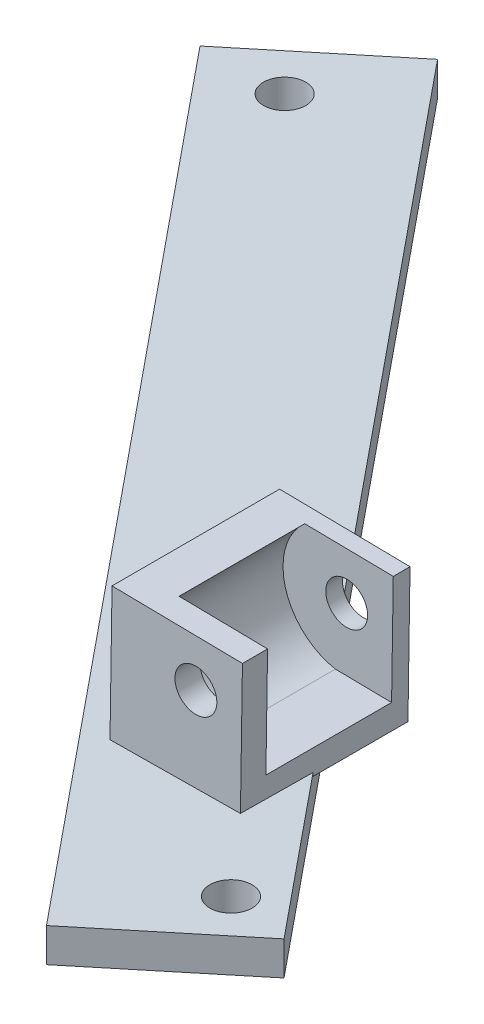
ISO-10303-21;
HEADER;
FILE_DESCRIPTION(('STEP AP214'),'2;1');
FILE_NAME('part.step','',(''),(''),'','','');
FILE_SCHEMA(('AUTOMOTIVE_DESIGN { 1 0 10303 214 1 1 1 1 }'));
ENDSEC;
DATA;
#1=APPLICATION_CONTEXT('core data for automotive mechanical design processes');
#2=APPLICATION_PROTOCOL_DEFINITION('international standard','automotive_design',2000,#1);
#3=PRODUCT_CONTEXT('',#1,'mechanical');
#4=PRODUCT('Part','Part','',(#3));
#5=PRODUCT_RELATED_PRODUCT_CATEGORY('part','',(#4));
#6=PRODUCT_DEFINITION_FORMATION('','',#4);
#7=PRODUCT_DEFINITION_CONTEXT('part definition',#1,'design');
#8=PRODUCT_DEFINITION('design','',#6,#7);
#9=PRODUCT_DEFINITION_SHAPE('','',#8);
#10=(LENGTH_UNIT() NAMED_UNIT(*) SI_UNIT(.MILLI.,.METRE.));
#11=(NAMED_UNIT(*) PLANE_ANGLE_UNIT() SI_UNIT($,.RADIAN.));
#12=(NAMED_UNIT(*) SI_UNIT($,.STERADIAN.) SOLID_ANGLE_UNIT());
#13=UNCERTAINTY_MEASURE_WITH_UNIT(LENGTH_MEASURE(1.E-05),#10,'distance_accuracy_value','');
#14=(GEOMETRIC_REPRESENTATION_CONTEXT(3) GLOBAL_UNCERTAINTY_ASSIGNED_CONTEXT((#13)) GLOBAL_UNIT_ASSIGNED_CONTEXT((#10,
#11,#12)) REPRESENTATION_CONTEXT('',''));
#15=CARTESIAN_POINT('',(0.,0.,0.));
#16=DIRECTION('',(0.,0.,1.));
#17=DIRECTION('',(1.,0.,0.));
#18=AXIS2_PLACEMENT_3D('',#15,#16,#17);
#19=CARTESIAN_POINT('',(1.23244160219368,80.7225949257512,-21.59));
#20=DIRECTION('',(0.0152658371215677,0.999883470318906,0.));
#21=DIRECTION('',(-0.999883470318906,0.0152658371215677,0.));
#22=AXIS2_PLACEMENT_3D('',#19,#20,#21);
#23=PLANE('',#22);
#24=DIRECTION('',(0.,0.,1.));
#25=VECTOR('',#24,1.);
#26=CARTESIAN_POINT('',(-621.150306901994,90.224895891791,-21.59));
#27=LINE('',#26,#25);
#28=CARTESIAN_POINT('',(-621.150306901994,90.224895891791,-21.59));
#29=VERTEX_POINT('',#28);
#30=CARTESIAN_POINT('',(-621.150306901994,90.224895891791,-7.21198114716159));
#31=VERTEX_POINT('',#30);
#32=EDGE_CURVE('E287',#29,#31,#27,.T.);
#33=ORIENTED_EDGE('',*,*,#32,.T.);
#34=DIRECTION('',(-0.634311385000374,0.00968442281047344,-0.773016997752142));
#35=VECTOR('',#34,1.);
#36=CARTESIAN_POINT('',(-377.72567926426,86.5083820907271,289.442594641894));
#37=LINE('',#36,#35);
#38=CARTESIAN_POINT('',(-632.948418817548,90.4050249370161,-21.59));
#39=VERTEX_POINT('',#38);
#40=EDGE_CURVE('E222',#31,#39,#37,.T.);
#41=ORIENTED_EDGE('',*,*,#40,.T.);
#42=DIRECTION('',(-0.999883470318906,0.0152658371215677,0.));
#43=VECTOR('',#42,1.);
#44=CARTESIAN_POINT('',(1.23244160219368,80.7225949257512,-21.59));
#45=LINE('',#44,#43);
#46=EDGE_CURVE('E274',#29,#39,#45,.T.);
#47=ORIENTED_EDGE('',*,*,#46,.F.);
#48=EDGE_LOOP('',(#33,#41,#47));
#49=FACE_BOUND('',#48,.T.);
#50=ADVANCED_FACE('F56',(#49),#23,.F.);
#51=CARTESIAN_POINT('',(-627.893070479448,103.664395922966,-21.59));
#52=DIRECTION('',(0.,0.,1.));
#53=DIRECTION('',(1.,0.,0.));
#54=AXIS2_PLACEMENT_3D('',#51,#52,#53);
#55=CYLINDRICAL_SURFACE('',#54,9.65200000000006);
#56=CARTESIAN_POINT('',(-627.893070479448,103.664395922966,-19.0499999999996));
#57=DIRECTION('',(0.,0.,-1.));
#58=DIRECTION('',(-1.,0.,0.));
#59=AXIS2_PLACEMENT_3D('',#56,#57,#58);
#60=CIRCLE('',#59,9.65200000000008);
#61=CARTESIAN_POINT('',(-629.598897848948,94.164329766067,-19.0499999999997));
#62=VERTEX_POINT('',#61);
#63=CARTESIAN_POINT('',(-634.25254540357,110.925124721748,-19.0499999999998));
#64=VERTEX_POINT('',#63);
#65=EDGE_CURVE('E254',#62,#64,#60,.T.);
#66=ORIENTED_EDGE('',*,*,#65,.T.);
#67=DIRECTION('',(0.,0.,1.));
#68=VECTOR('',#67,1.);
#69=CARTESIAN_POINT('',(-634.25254540357,110.925124721748,-21.59));
#70=LINE('',#69,#68);
#71=CARTESIAN_POINT('',(-634.25254540357,110.925124721748,0.));
#72=VERTEX_POINT('',#71);
#73=EDGE_CURVE('E279',#64,#72,#70,.T.);
#74=ORIENTED_EDGE('',*,*,#73,.T.);
#75=CARTESIAN_POINT('',(-627.893070479448,103.664395922966,0.));
#76=DIRECTION('',(0.,0.,1.));
#77=DIRECTION('',(1.,0.,0.));
#78=AXIS2_PLACEMENT_3D('',#75,#76,#77);
#79=CIRCLE('',#78,9.65200000000006);
#80=CARTESIAN_POINT('',(-629.598897848948,94.164329766067,0.));
#81=VERTEX_POINT('',#80);
#82=EDGE_CURVE('E267',#72,#81,#79,.T.);
#83=ORIENTED_EDGE('',*,*,#82,.T.);
#84=DIRECTION('',(0.,0.,1.));
#85=VECTOR('',#84,1.);
#86=CARTESIAN_POINT('',(-629.598897848948,94.164329766067,-21.59));
#87=LINE('',#86,#85);
#88=EDGE_CURVE('E283',#62,#81,#87,.T.);
#89=ORIENTED_EDGE('',*,*,#88,.F.);
#90=EDGE_LOOP('',(#66,#74,#83,#89));
#91=FACE_BOUND('',#90,.T.);
#92=ADVANCED_FACE('F58',(#91),#55,.F.);
#93=CARTESIAN_POINT('',(1.29060444162685,84.5321509476663,-21.59));
#94=DIRECTION('',(0.0152658371215677,0.999883470318906,0.));
#95=DIRECTION('',(-0.999883470318906,0.0152658371215677,0.));
#96=AXIS2_PLACEMENT_3D('',#93,#94,#95);
#97=PLANE('',#96);
#98=DIRECTION('',(0.,0.,1.));
#99=VECTOR('',#98,1.);
#100=CARTESIAN_POINT('',(-621.092144062561,94.0344519137061,-21.59));
#101=LINE('',#100,#99);
#102=CARTESIAN_POINT('',(-621.092144062561,94.0344519137061,-19.0499999999996));
#103=VERTEX_POINT('',#102);
#104=CARTESIAN_POINT('',(-621.092144062561,94.0344519137061,0.));
#105=VERTEX_POINT('',#104);
#106=EDGE_CURVE('E285',#103,#105,#101,.T.);
#107=ORIENTED_EDGE('',*,*,#106,.F.);
#108=DIRECTION('',(-0.999883470318906,0.0152658371215695,0.));
#109=VECTOR('',#108,1.);
#110=CARTESIAN_POINT('',(1.29060444162699,84.5321509476652,-19.05));
#111=LINE('',#110,#109);
#112=EDGE_CURVE('E79',#103,#62,#111,.T.);
#113=ORIENTED_EDGE('',*,*,#112,.T.);
#114=ORIENTED_EDGE('',*,*,#88,.T.);
#115=DIRECTION('',(-0.999883470318906,0.0152658371215677,0.));
#116=VECTOR('',#115,1.);
#117=CARTESIAN_POINT('',(1.29060444162685,84.5321509476663,0.));
#118=LINE('',#117,#116);
#119=EDGE_CURVE('E271',#105,#81,#118,.T.);
#120=ORIENTED_EDGE('',*,*,#119,.F.);
#121=EDGE_LOOP('',(#107,#113,#114,#120));
#122=FACE_BOUND('',#121,.T.);
#123=ADVANCED_FACE('F340',(#122),#97,.T.);
#124=CARTESIAN_POINT('',(-622.382748504188,9.50230096603983,-21.59));
#125=DIRECTION('',(-0.999883470318906,0.0152658371215677,0.));
#126=DIRECTION('',(-0.0152658371215678,-0.999883470318906,0.));
#127=AXIS2_PLACEMENT_3D('',#124,#125,#126);
#128=PLANE('',#127);
#129=DIRECTION('',(-0.000170947301251259,-0.0111967250440051,-0.999937300097016));
#130=VECTOR('',#129,1.);
#131=CARTESIAN_POINT('',(-621.144892584329,90.5795234627043,-22.4980679115256));
#132=LINE('',#131,#130);
#133=CARTESIAN_POINT('',(-621.140395009121,90.8741061358537,3.81));
#134=VERTEX_POINT('',#133);
#135=CARTESIAN_POINT('',(-621.142277501478,90.750806445438,-7.20143048993949));
#136=VERTEX_POINT('',#135);
#137=EDGE_CURVE('E71',#134,#136,#132,.T.);
#138=ORIENTED_EDGE('',*,*,#137,.T.);
#139=DIRECTION('',(-0.0152627667310032,-0.999682365541718,-0.0200553229001458));
#140=VECTOR('',#139,1.);
#141=CARTESIAN_POINT('',(-622.38665390396,9.24650466437761,-8.83654494860487));
#142=LINE('',#141,#140);
#143=EDGE_CURVE('E225',#136,#31,#142,.T.);
#144=ORIENTED_EDGE('',*,*,#143,.T.);
#145=ORIENTED_EDGE('',*,*,#32,.F.);
#146=DIRECTION('',(-0.0152658371215678,-0.999883470318906,0.));
#147=VECTOR('',#146,1.);
#148=CARTESIAN_POINT('',(-622.382748504188,9.50230096603983,-21.59));
#149=LINE('',#148,#147);
#150=CARTESIAN_POINT('',(-620.837390825843,110.720307289694,-21.59));
#151=VERTEX_POINT('',#150);
#152=EDGE_CURVE('E277',#151,#29,#149,.T.);
#153=ORIENTED_EDGE('',*,*,#152,.F.);
#154=DIRECTION('',(0.,0.,1.));
#155=VECTOR('',#154,1.);
#156=CARTESIAN_POINT('',(-620.837390825843,110.720307289694,-45.3479752360297));
#157=LINE('',#156,#155);
#158=CARTESIAN_POINT('',(-620.837390825843,110.720307289694,-19.0499999999998));
#159=VERTEX_POINT('',#158);
#160=EDGE_CURVE('E262',#151,#159,#157,.T.);
#161=ORIENTED_EDGE('',*,*,#160,.T.);
#162=DIRECTION('',(0.0152658371215684,0.999883470318906,0.));
#163=VECTOR('',#162,1.);
#164=CARTESIAN_POINT('',(-622.382748504188,9.50230096604021,-19.0499999999996));
#165=LINE('',#164,#163);
#166=EDGE_CURVE('E250',#103,#159,#165,.T.);
#167=ORIENTED_EDGE('',*,*,#166,.F.);
#168=ORIENTED_EDGE('',*,*,#106,.T.);
#169=DIRECTION('',(-0.0152658371215623,-0.999883470318906,0.));
#170=VECTOR('',#169,1.);
#171=CARTESIAN_POINT('',(-620.837390825843,110.720307289694,0.));
#172=LINE('',#171,#170);
#173=CARTESIAN_POINT('',(-620.837390825843,110.720307289694,0.));
#174=VERTEX_POINT('',#173);
#175=EDGE_CURVE('E238',#174,#105,#172,.T.);
#176=ORIENTED_EDGE('',*,*,#175,.F.);
#177=DIRECTION('',(0.,0.,-1.));
#178=VECTOR('',#177,1.);
#179=CARTESIAN_POINT('',(-620.837390825843,110.720307289694,3.81));
#180=LINE('',#179,#178);
#181=CARTESIAN_POINT('',(-620.837390825843,110.720307289694,3.81));
#182=VERTEX_POINT('',#181);
#183=EDGE_CURVE('E244',#182,#174,#180,.T.);
#184=ORIENTED_EDGE('',*,*,#183,.F.);
#185=DIRECTION('',(-0.0152658371215623,-0.999883470318906,0.));
#186=VECTOR('',#185,1.);
#187=CARTESIAN_POINT('',(-620.837390825843,110.720307289694,3.81));
#188=LINE('',#187,#186);
#189=EDGE_CURVE('E241',#182,#134,#188,.T.);
#190=ORIENTED_EDGE('',*,*,#189,.T.);
#191=EDGE_LOOP('',(#138,#144,#145,#153,#161,#167,#168,#176,#184,#190));
#192=FACE_BOUND('',#191,.T.);
#193=ADVANCED_FACE('F303',(#192),#128,.F.);
#194=CARTESIAN_POINT('',(-635.371075882775,90.4420131353982,-21.59));
#195=VERTEX_POINT('',#194);
#196=CARTESIAN_POINT('',(-640.914721516246,90.5266513895672,-21.59));
#197=VERTEX_POINT('',#196);
#198=EDGE_CURVE('E273',#195,#197,#45,.T.);
#199=ORIENTED_EDGE('',*,*,#198,.F.);
#200=DIRECTION('',(-0.400047773889427,0.00610777589421889,0.916473935079302));
#201=VECTOR('',#200,1.);
#202=CARTESIAN_POINT('',(-533.46643276404,88.8861721499623,-255.044490632144));
#203=LINE('',#202,#201);
#204=CARTESIAN_POINT('',(-640.914721516246,90.5266513895672,-8.89000000001139));
#205=VERTEX_POINT('',#204);
#206=EDGE_CURVE('E215',#195,#205,#203,.T.);
#207=ORIENTED_EDGE('',*,*,#206,.T.);
#208=DIRECTION('',(0.,0.,1.));
#209=VECTOR('',#208,1.);
#210=CARTESIAN_POINT('',(-640.914721516246,90.5266513895672,-21.59));
#211=LINE('',#210,#209);
#212=EDGE_CURVE('E290',#197,#205,#211,.T.);
#213=ORIENTED_EDGE('',*,*,#212,.F.);
#214=EDGE_LOOP('',(#199,#207,#213));
#215=FACE_BOUND('',#214,.T.);
#216=ADVANCED_FACE('F318',(#215),#23,.F.);
#217=CARTESIAN_POINT('',(-642.147163118439,9.80405646381606,-21.59));
#218=DIRECTION('',(0.999883470318906,-0.0152658371215678,0.));
#219=DIRECTION('',(0.0152658371215678,0.999883470318906,0.));
#220=AXIS2_PLACEMENT_3D('',#217,#218,#219);
#221=PLANE('',#220);
#222=ORIENTED_EDGE('',*,*,#212,.T.);
#223=DIRECTION('',(0.000170947301251259,0.0111967250440051,0.999937300097016));
#224=VECTOR('',#223,1.);
#225=CARTESIAN_POINT('',(-640.917046953941,90.3743396169369,-22.4923901719979));
#226=LINE('',#225,#224);
#227=CARTESIAN_POINT('',(-640.912550349388,90.6688587140116,3.81));
#228=VERTEX_POINT('',#227);
#229=EDGE_CURVE('E209',#205,#228,#226,.T.);
#230=ORIENTED_EDGE('',*,*,#229,.T.);
#231=DIRECTION('',(0.0152658371215677,0.999883470318906,0.));
#232=VECTOR('',#231,1.);
#233=CARTESIAN_POINT('',(-640.914721516246,90.5266513895672,3.81));
#234=LINE('',#233,#232);
#235=CARTESIAN_POINT('',(-640.601805440095,111.02206278747,3.81));
#236=VERTEX_POINT('',#235);
#237=EDGE_CURVE('E235',#228,#236,#234,.T.);
#238=ORIENTED_EDGE('',*,*,#237,.T.);
#239=DIRECTION('',(0.,0.,1.));
#240=VECTOR('',#239,1.);
#241=CARTESIAN_POINT('',(-640.601805440095,111.02206278747,-21.59));
#242=LINE('',#241,#240);
#243=CARTESIAN_POINT('',(-640.601805440095,111.02206278747,-21.59));
#244=VERTEX_POINT('',#243);
#245=EDGE_CURVE('E293',#244,#236,#242,.T.);
#246=ORIENTED_EDGE('',*,*,#245,.F.);
#247=DIRECTION('',(0.0152658371215678,0.999883470318906,0.));
#248=VECTOR('',#247,1.);
#249=CARTESIAN_POINT('',(-642.147163118439,9.80405646381606,-21.59));
#250=LINE('',#249,#248);
#251=EDGE_CURVE('E270',#197,#244,#250,.T.);
#252=ORIENTED_EDGE('',*,*,#251,.F.);
#253=EDGE_LOOP('',(#222,#230,#238,#246,#252));
#254=FACE_BOUND('',#253,.T.);
#255=ADVANCED_FACE('F313',(#254),#221,.F.);
#256=CARTESIAN_POINT('',(1.54535767834408,101.218006323655,-21.59));
#257=DIRECTION('',(-0.015265837121567,-0.999883470318906,0.));
#258=DIRECTION('',(0.999883470318906,-0.015265837121567,0.));
#259=AXIS2_PLACEMENT_3D('',#256,#257,#258);
#260=PLANE('',#259);
#261=ORIENTED_EDGE('',*,*,#245,.T.);
#262=DIRECTION('',(0.999883470318906,-0.0152658371215671,0.));
#263=VECTOR('',#262,1.);
#264=CARTESIAN_POINT('',(-640.601805440095,111.02206278747,3.81));
#265=LINE('',#264,#263);
#266=EDGE_CURVE('E237',#236,#182,#265,.T.);
#267=ORIENTED_EDGE('',*,*,#266,.T.);
#268=ORIENTED_EDGE('',*,*,#183,.T.);
#269=DIRECTION('',(0.999883470318906,-0.0152658371215671,0.));
#270=VECTOR('',#269,1.);
#271=CARTESIAN_POINT('',(-640.601805440095,111.02206278747,0.));
#272=LINE('',#271,#270);
#273=EDGE_CURVE('E232',#72,#174,#272,.T.);
#274=ORIENTED_EDGE('',*,*,#273,.F.);
#275=ORIENTED_EDGE('',*,*,#73,.F.);
#276=DIRECTION('',(0.999883470318906,-0.0152658371215682,0.));
#277=VECTOR('',#276,1.);
#278=CARTESIAN_POINT('',(1.54535767834418,101.218006323654,-19.0499999999998));
#279=LINE('',#278,#277);
#280=EDGE_CURVE('E256',#64,#159,#279,.T.);
#281=ORIENTED_EDGE('',*,*,#280,.T.);
#282=ORIENTED_EDGE('',*,*,#160,.F.);
#283=DIRECTION('',(0.999883470318906,-0.015265837121567,0.));
#284=VECTOR('',#283,1.);
#285=CARTESIAN_POINT('',(1.54535767834408,101.218006323655,-21.59));
#286=LINE('',#285,#284);
#287=EDGE_CURVE('E268',#244,#151,#286,.T.);
#288=ORIENTED_EDGE('',*,*,#287,.F.);
#289=EDGE_LOOP('',(#261,#267,#268,#274,#275,#281,#282,#288));
#290=FACE_BOUND('',#289,.T.);
#291=ADVANCED_FACE('F307',(#290),#260,.F.);
#292=CARTESIAN_POINT('',(0.,0.,-21.59));
#293=DIRECTION('',(0.,0.,1.));
#294=DIRECTION('',(1.,0.,0.));
#295=AXIS2_PLACEMENT_3D('',#292,#293,#294);
#296=PLANE('',#295);
#297=ORIENTED_EDGE('',*,*,#46,.T.);
#298=DIRECTION('',(-0.00119402567209791,0.999999287151093,0.));
#299=VECTOR('',#298,1.);
#300=CARTESIAN_POINT('',(-632.83957058098,-0.755627232241151,-21.59));
#301=LINE('',#300,#299);
#302=CARTESIAN_POINT('',(-632.94849300974,90.467161070984,-21.59));
#303=VERTEX_POINT('',#302);
#304=EDGE_CURVE('E12',#39,#303,#301,.T.);
#305=ORIENTED_EDGE('',*,*,#304,.T.);
#306=DIRECTION('',(-0.999946125618088,-0.0103800703935441,0.));
#307=VECTOR('',#306,1.);
#308=CARTESIAN_POINT('',(-1.00720248977155,97.0271095643389,-21.59));
#309=LINE('',#308,#307);
#310=EDGE_CURVE('E219',#303,#195,#309,.T.);
#311=ORIENTED_EDGE('',*,*,#310,.T.);
#312=ORIENTED_EDGE('',*,*,#198,.T.);
#313=ORIENTED_EDGE('',*,*,#251,.T.);
#314=ORIENTED_EDGE('',*,*,#287,.T.);
#315=ORIENTED_EDGE('',*,*,#152,.T.);
#316=EDGE_LOOP('',(#297,#305,#311,#312,#313,#314,#315));
#317=FACE_BOUND('',#316,.T.);
#318=CARTESIAN_POINT('',(-627.893070479448,103.664395922966,-21.59));
#319=DIRECTION('',(0.,0.,1.));
#320=DIRECTION('',(1.,0.,0.));
#321=AXIS2_PLACEMENT_3D('',#318,#319,#320);
#322=CIRCLE('',#321,3.17500000000009);
#323=CARTESIAN_POINT('',(-624.718070479448,103.664395922966,-21.59));
#324=VERTEX_POINT('',#323);
#325=EDGE_CURVE('E264',#324,#324,#322,.F.);
#326=ORIENTED_EDGE('',*,*,#325,.F.);
#327=EDGE_LOOP('',(#326));
#328=FACE_BOUND('',#327,.T.);
#329=ADVANCED_FACE('F320',(#317,#328),#296,.F.);
#330=CARTESIAN_POINT('',(1.11022302462516E-13,0.,-19.0499999999998));
#331=DIRECTION('',(0.,0.,-1.));
#332=DIRECTION('',(-1.,0.,0.));
#333=AXIS2_PLACEMENT_3D('',#330,#331,#332);
#334=PLANE('',#333);
#335=ORIENTED_EDGE('',*,*,#166,.T.);
#336=ORIENTED_EDGE('',*,*,#280,.F.);
#337=ORIENTED_EDGE('',*,*,#65,.F.);
#338=ORIENTED_EDGE('',*,*,#112,.F.);
#339=EDGE_LOOP('',(#335,#336,#337,#338));
#340=FACE_BOUND('',#339,.T.);
#341=CARTESIAN_POINT('',(-627.893070479448,103.664395922966,-19.0499999999996));
#342=DIRECTION('',(0.,0.,-1.));
#343=DIRECTION('',(-1.,0.,0.));
#344=AXIS2_PLACEMENT_3D('',#341,#342,#343);
#345=CIRCLE('',#344,3.17500000000009);
#346=CARTESIAN_POINT('',(-631.068070479448,103.664395922966,-19.0499999999996));
#347=VERTEX_POINT('',#346);
#348=EDGE_CURVE('E259',#347,#347,#345,.F.);
#349=ORIENTED_EDGE('',*,*,#348,.F.);
#350=EDGE_LOOP('',(#349));
#351=FACE_BOUND('',#350,.T.);
#352=ADVANCED_FACE('F337',(#340,#351),#334,.F.);
#353=CARTESIAN_POINT('',(-627.893070479448,103.664395922966,-45.3479752360294));
#354=DIRECTION('',(0.,0.,1.));
#355=DIRECTION('',(1.,0.,0.));
#356=AXIS2_PLACEMENT_3D('',#353,#354,#355);
#357=CYLINDRICAL_SURFACE('',#356,3.17500000000009);
#358=ORIENTED_EDGE('',*,*,#325,.T.);
#359=EDGE_LOOP('',(#358));
#360=FACE_BOUND('',#359,.T.);
#361=ORIENTED_EDGE('',*,*,#348,.T.);
#362=EDGE_LOOP('',(#361));
#363=FACE_BOUND('',#362,.T.);
#364=ADVANCED_FACE('F368',(#360,#363),#357,.F.);
#365=CARTESIAN_POINT('',(0.,0.,0.));
#366=DIRECTION('',(0.,0.,-1.));
#367=DIRECTION('',(-1.,0.,0.));
#368=AXIS2_PLACEMENT_3D('',#365,#366,#367);
#369=PLANE('',#368);
#370=CARTESIAN_POINT('',(-627.893070479448,103.664395922966,0.));
#371=DIRECTION('',(0.,0.,1.));
#372=DIRECTION('',(1.,0.,0.));
#373=AXIS2_PLACEMENT_3D('',#370,#371,#372);
#374=CIRCLE('',#373,3.17500000000008);
#375=CARTESIAN_POINT('',(-631.068070479448,103.664395922966,0.));
#376=VERTEX_POINT('',#375);
#377=EDGE_CURVE('E228',#376,#376,#374,.T.);
#378=ORIENTED_EDGE('',*,*,#377,.T.);
#379=EDGE_LOOP('',(#378));
#380=FACE_BOUND('',#379,.T.);
#381=ORIENTED_EDGE('',*,*,#82,.F.);
#382=ORIENTED_EDGE('',*,*,#273,.T.);
#383=ORIENTED_EDGE('',*,*,#175,.T.);
#384=ORIENTED_EDGE('',*,*,#119,.T.);
#385=EDGE_LOOP('',(#381,#382,#383,#384));
#386=FACE_BOUND('',#385,.T.);
#387=ADVANCED_FACE('F343',(#380,#386),#369,.T.);
#388=CARTESIAN_POINT('',(0.,0.,3.81));
#389=DIRECTION('',(0.,0.,-1.));
#390=DIRECTION('',(-1.,0.,0.));
#391=AXIS2_PLACEMENT_3D('',#388,#389,#390);
#392=PLANE('',#391);
#393=ORIENTED_EDGE('',*,*,#237,.F.);
#394=DIRECTION('',(0.999946125618088,0.0103800703935441,0.));
#395=VECTOR('',#394,1.);
#396=CARTESIAN_POINT('',(-1.01015410692916,97.3114484974248,3.81));
#397=LINE('',#396,#395);
#398=EDGE_CURVE('E64',#228,#134,#397,.T.);
#399=ORIENTED_EDGE('',*,*,#398,.T.);
#400=ORIENTED_EDGE('',*,*,#189,.F.);
#401=ORIENTED_EDGE('',*,*,#266,.F.);
#402=EDGE_LOOP('',(#393,#399,#400,#401));
#403=FACE_BOUND('',#402,.T.);
#404=CARTESIAN_POINT('',(-627.893070479448,103.664395922966,3.81));
#405=DIRECTION('',(0.,0.,1.));
#406=DIRECTION('',(1.,0.,0.));
#407=AXIS2_PLACEMENT_3D('',#404,#405,#406);
#408=CIRCLE('',#407,3.17500000000008);
#409=CARTESIAN_POINT('',(-631.068070479448,103.664395922966,3.81));
#410=VERTEX_POINT('',#409);
#411=EDGE_CURVE('E229',#410,#410,#408,.T.);
#412=ORIENTED_EDGE('',*,*,#411,.F.);
#413=EDGE_LOOP('',(#412));
#414=FACE_BOUND('',#413,.T.);
#415=ADVANCED_FACE('F299',(#403,#414),#392,.F.);
#416=CARTESIAN_POINT('',(-627.893070479448,103.664395922966,3.81));
#417=DIRECTION('',(0.,0.,-1.));
#418=DIRECTION('',(-1.,0.,0.));
#419=AXIS2_PLACEMENT_3D('',#416,#417,#418);
#420=CYLINDRICAL_SURFACE('',#419,3.17500000000008);
#421=CARTESIAN_POINT('',(-631.068070479448,103.664395922966,3.81));
#422=CARTESIAN_POINT('',(-631.068070479448,103.664395922966,3.7703125));
#423=CARTESIAN_POINT('',(-631.068070479448,103.664395922966,3.730625));
#424=CARTESIAN_POINT('',(-631.068070479448,103.664395922966,3.65125));
#425=CARTESIAN_POINT('',(-631.068070479448,103.664395922966,3.6115625));
#426=CARTESIAN_POINT('',(-631.068070479448,103.664395922966,3.5321875));
#427=CARTESIAN_POINT('',(-631.068070479448,103.664395922966,3.4925));
#428=CARTESIAN_POINT('',(-631.068070479448,103.664395922966,3.413125));
#429=CARTESIAN_POINT('',(-631.068070479448,103.664395922966,3.3734375));
#430=CARTESIAN_POINT('',(-631.068070479448,103.664395922966,3.2940625));
#431=CARTESIAN_POINT('',(-631.068070479448,103.664395922966,3.254375));
#432=CARTESIAN_POINT('',(-631.068070479448,103.664395922966,3.175));
#433=CARTESIAN_POINT('',(-631.068070479448,103.664395922966,3.1353125));
#434=CARTESIAN_POINT('',(-631.068070479448,103.664395922966,3.0559375));
#435=CARTESIAN_POINT('',(-631.068070479448,103.664395922966,3.01625));
#436=CARTESIAN_POINT('',(-631.068070479448,103.664395922966,2.936875));
#437=CARTESIAN_POINT('',(-631.068070479448,103.664395922966,2.8971875));
#438=CARTESIAN_POINT('',(-631.068070479448,103.664395922966,2.8178125));
#439=CARTESIAN_POINT('',(-631.068070479448,103.664395922966,2.778125));
#440=CARTESIAN_POINT('',(-631.068070479448,103.664395922966,2.69875));
#441=CARTESIAN_POINT('',(-631.068070479448,103.664395922966,2.6590625));
#442=CARTESIAN_POINT('',(-631.068070479448,103.664395922966,2.5796875));
#443=CARTESIAN_POINT('',(-631.068070479448,103.664395922966,2.54));
#444=CARTESIAN_POINT('',(-631.068070479448,103.664395922966,2.460625));
#445=CARTESIAN_POINT('',(-631.068070479448,103.664395922966,2.4209375));
#446=CARTESIAN_POINT('',(-631.068070479448,103.664395922966,2.3415625));
#447=CARTESIAN_POINT('',(-631.068070479448,103.664395922966,2.301875));
#448=CARTESIAN_POINT('',(-631.068070479448,103.664395922966,2.2225));
#449=CARTESIAN_POINT('',(-631.068070479448,103.664395922966,2.1828125));
#450=CARTESIAN_POINT('',(-631.068070479448,103.664395922966,2.1034375));
#451=CARTESIAN_POINT('',(-631.068070479448,103.664395922966,2.06375));
#452=CARTESIAN_POINT('',(-631.068070479448,103.664395922966,1.984375));
#453=CARTESIAN_POINT('',(-631.068070479448,103.664395922966,1.9446875));
#454=CARTESIAN_POINT('',(-631.068070479448,103.664395922966,1.8653125));
#455=CARTESIAN_POINT('',(-631.068070479448,103.664395922966,1.825625));
#456=CARTESIAN_POINT('',(-631.068070479448,103.664395922966,1.74625));
#457=CARTESIAN_POINT('',(-631.068070479448,103.664395922966,1.7065625));
#458=CARTESIAN_POINT('',(-631.068070479448,103.664395922966,1.6271875));
#459=CARTESIAN_POINT('',(-631.068070479448,103.664395922966,1.5875));
#460=CARTESIAN_POINT('',(-631.068070479448,103.664395922966,1.508125));
#461=CARTESIAN_POINT('',(-631.068070479448,103.664395922966,1.4684375));
#462=CARTESIAN_POINT('',(-631.068070479448,103.664395922966,1.3890625));
#463=CARTESIAN_POINT('',(-631.068070479448,103.664395922966,1.349375));
#464=CARTESIAN_POINT('',(-631.068070479448,103.664395922966,1.27));
#465=CARTESIAN_POINT('',(-631.068070479448,103.664395922966,1.2303125));
#466=CARTESIAN_POINT('',(-631.068070479448,103.664395922966,1.1509375));
#467=CARTESIAN_POINT('',(-631.068070479448,103.664395922966,1.11125));
#468=CARTESIAN_POINT('',(-631.068070479448,103.664395922966,1.031875));
#469=CARTESIAN_POINT('',(-631.068070479448,103.664395922966,0.9921875));
#470=CARTESIAN_POINT('',(-631.068070479448,103.664395922966,0.9128125));
#471=CARTESIAN_POINT('',(-631.068070479448,103.664395922966,0.873125));
#472=CARTESIAN_POINT('',(-631.068070479448,103.664395922966,0.79375));
#473=CARTESIAN_POINT('',(-631.068070479448,103.664395922966,0.7540625));
#474=CARTESIAN_POINT('',(-631.068070479448,103.664395922966,0.6746875));
#475=CARTESIAN_POINT('',(-631.068070479448,103.664395922966,0.635));
#476=CARTESIAN_POINT('',(-631.068070479448,103.664395922966,0.555625));
#477=CARTESIAN_POINT('',(-631.068070479448,103.664395922966,0.5159375));
#478=CARTESIAN_POINT('',(-631.068070479448,103.664395922966,0.4365625));
#479=CARTESIAN_POINT('',(-631.068070479448,103.664395922966,0.396875));
#480=CARTESIAN_POINT('',(-631.068070479448,103.664395922966,0.3175));
#481=CARTESIAN_POINT('',(-631.068070479448,103.664395922966,0.2778125));
#482=CARTESIAN_POINT('',(-631.068070479448,103.664395922966,0.1984375));
#483=CARTESIAN_POINT('',(-631.068070479448,103.664395922966,0.15875));
#484=CARTESIAN_POINT('',(-631.068070479448,103.664395922966,0.0793749999999999));
#485=CARTESIAN_POINT('',(-631.068070479448,103.664395922966,0.0396874999999999));
#486=CARTESIAN_POINT('',(-631.068070479448,103.664395922966,0.));
#487=B_SPLINE_CURVE_WITH_KNOTS('',3,(#421,#422,#423,#424,#425,#426,#427,#428,#429,#430,#431,
#432,#433,#434,#435,#436,#437,#438,#439,#440,#441,#442,#443,#444,#445,#446,#447,#448,#449,#450,
#451,#452,#453,#454,#455,#456,#457,#458,#459,#460,#461,#462,#463,#464,#465,#466,#467,#468,#469,
#470,#471,#472,#473,#474,#475,#476,#477,#478,#479,#480,#481,#482,#483,#484,#485,#486),
.UNSPECIFIED.,.F.,.F.,(4,2,2,2,2,2,2,2,2,2,2,2,2,2,2,2,2,2,2,2,2,2,2,2,2,2,2,2,2,2,2,2,4),(0.,
0.1190625,0.238125,0.3571875,0.47625,0.595312499999999,0.714375,0.833437499999999,
0.952499999999999,1.0715625,1.190625,1.3096875,1.42875,1.5478125,1.666875,1.7859375,1.905,
2.0240625,2.143125,2.2621875,2.38125,2.5003125,2.619375,2.7384375,2.8575,2.9765625,3.095625,
3.2146875,3.33375,3.4528125,3.571875,3.6909375,3.81),.UNSPECIFIED.);
#488=EDGE_CURVE('BSEAM378',#410,#376,#487,.T.);
#489=ORIENTED_EDGE('',*,*,#411,.T.);
#490=ORIENTED_EDGE('',*,*,#377,.F.);
#491=ORIENTED_EDGE('',*,*,#488,.T.);
#492=ORIENTED_EDGE('',*,*,#488,.F.);
#493=EDGE_LOOP('',(#489,#491,#490,#492));
#494=FACE_BOUND('',#493,.T.);
#495=ADVANCED_FACE('F378',(#494),#420,.F.);
#496=CARTESIAN_POINT('',(-600.962950349845,86.1549417586084,17.3842943767638));
#497=DIRECTION('',(0.77305859160453,0.000923052462408597,-0.634333951417211));
#498=DIRECTION('',(-0.634334221651845,0.,-0.773058920937691));
#499=AXIS2_PLACEMENT_3D('',#496,#497,#498);
#500=PLANE('',#499);
#501=ORIENTED_EDGE('',*,*,#143,.F.);
#502=DIRECTION('',(-0.634249699713803,-0.0152379052751319,-0.772978088082565));
#503=VECTOR('',#502,1.);
#504=CARTESIAN_POINT('',(-601.015677803405,91.2343497878284,17.3274270897168));
#505=LINE('',#504,#503);
#506=CARTESIAN_POINT('',(-601.015677803405,91.2343497878284,17.3274270897168));
#507=VERTEX_POINT('',#506);
#508=EDGE_CURVE('E191',#507,#136,#505,.T.);
#509=ORIENTED_EDGE('',*,*,#508,.F.);
#510=DIRECTION('',(-0.0103794199920881,0.999883470318906,-0.011194347843894));
#511=VECTOR('',#510,1.);
#512=CARTESIAN_POINT('',(-600.962950349845,86.1549417586084,17.3842943767638));
#513=LINE('',#512,#511);
#514=CARTESIAN_POINT('',(-600.962950349845,86.1549417586084,17.3842943767638));
#515=VERTEX_POINT('',#514);
#516=EDGE_CURVE('E210',#515,#507,#513,.T.);
#517=ORIENTED_EDGE('',*,*,#516,.F.);
#518=DIRECTION('',(-0.634249699713803,-0.0152379052751319,-0.772978088082565));
#519=VECTOR('',#518,1.);
#520=CARTESIAN_POINT('',(-600.962950349845,86.1549417586084,17.3842943767638));
#521=LINE('',#520,#519);
#522=CARTESIAN_POINT('',(-707.337114426303,83.5992930343759,-112.256914765794));
#523=VERTEX_POINT('',#522);
#524=EDGE_CURVE('E176',#515,#523,#521,.T.);
#525=ORIENTED_EDGE('',*,*,#524,.T.);
#526=DIRECTION('',(-0.0103794199920881,0.999883470318906,-0.011194347843894));
#527=VECTOR('',#526,1.);
#528=CARTESIAN_POINT('',(-707.337114426303,83.5992930343759,-112.256914765794));
#529=LINE('',#528,#527);
#530=CARTESIAN_POINT('',(-707.389841879863,88.678701063596,-112.313782052841));
#531=VERTEX_POINT('',#530);
#532=EDGE_CURVE('E190',#523,#531,#529,.T.);
#533=ORIENTED_EDGE('',*,*,#532,.T.);
#534=EDGE_CURVE('E193',#303,#531,#505,.T.);
#535=ORIENTED_EDGE('',*,*,#534,.F.);
#536=ORIENTED_EDGE('',*,*,#304,.F.);
#537=ORIENTED_EDGE('',*,*,#40,.F.);
#538=EDGE_LOOP('',(#501,#509,#517,#525,#533,#535,#536,#537));
#539=FACE_BOUND('',#538,.T.);
#540=ADVANCED_FACE('F324',(#539),#500,.T.);
#541=CARTESIAN_POINT('',(-1.00958483396755,97.2566085714132,-1.08885118994776));
#542=DIRECTION('',(-0.0103794199920881,0.999883470318906,-0.011194347843894));
#543=DIRECTION('',(0.,0.0111949508893725,0.999937334573815));
#544=AXIS2_PLACEMENT_3D('',#541,#542,#543);
#545=PLANE('',#544);
#546=CARTESIAN_POINT('',(-714.339059039859,88.7882314610112,-96.0871576951027));
#547=DIRECTION('',(-0.0103794199920881,0.999883470318906,-0.011194347843894));
#548=DIRECTION('',(0.,0.0111949508893725,0.999937334573814));
#549=AXIS2_PLACEMENT_3D('',#546,#547,#548);
#550=CIRCLE('',#549,3.1750000000001);
#551=CARTESIAN_POINT('',(-714.339059039859,88.8237754300849,-92.9123566578308));
#552=VERTEX_POINT('',#551);
#553=EDGE_CURVE('E196',#552,#552,#550,.T.);
#554=ORIENTED_EDGE('',*,*,#553,.F.);
#555=EDGE_LOOP('',(#554));
#556=FACE_BOUND('',#555,.T.);
#557=CARTESIAN_POINT('',(-610.732603344143,91.1147450383382,15.6538360034777));
#558=DIRECTION('',(-0.0103794199920881,0.999883470318906,-0.011194347843894));
#559=DIRECTION('',(0.,0.0111949508893725,0.999937334573814));
#560=AXIS2_PLACEMENT_3D('',#557,#558,#559);
#561=CIRCLE('',#560,3.1750000000001);
#562=CARTESIAN_POINT('',(-610.732603344143,91.1502890074119,18.8286370407496));
#563=VERTEX_POINT('',#562);
#564=EDGE_CURVE('E411',#563,#563,#561,.T.);
#565=ORIENTED_EDGE('',*,*,#564,.F.);
#566=EDGE_LOOP('',(#565));
#567=FACE_BOUND('',#566,.T.);
#568=ORIENTED_EDGE('',*,*,#310,.F.);
#569=ORIENTED_EDGE('',*,*,#534,.T.);
#570=DIRECTION('',(-0.773058591604527,-0.000923052462408555,0.634333951417214));
#571=VECTOR('',#570,1.);
#572=CARTESIAN_POINT('',(-707.389841879863,88.678701063596,-112.313782052841));
#573=LINE('',#572,#571);
#574=CARTESIAN_POINT('',(-727.166938310777,88.6550866859044,-96.0856670524725));
#575=VERTEX_POINT('',#574);
#576=EDGE_CURVE('E201',#531,#575,#573,.T.);
#577=ORIENTED_EDGE('',*,*,#576,.T.);
#578=DIRECTION('',(0.634249699713808,0.0152379052751319,0.772978088082561));
#579=VECTOR('',#578,1.);
#580=CARTESIAN_POINT('',(-727.166938310777,88.6550866859044,-96.0856670524725));
#581=LINE('',#580,#579);
#582=CARTESIAN_POINT('',(-620.792774234318,91.2107354101369,33.5555420900846));
#583=VERTEX_POINT('',#582);
#584=EDGE_CURVE('E170',#575,#583,#581,.T.);
#585=ORIENTED_EDGE('',*,*,#584,.T.);
#586=DIRECTION('',(0.773058591604525,0.000923052462408051,-0.634333951417217));
#587=VECTOR('',#586,1.);
#588=CARTESIAN_POINT('',(-620.792774234318,91.2107354101369,33.5555420900846));
#589=LINE('',#588,#587);
#590=EDGE_CURVE('E205',#583,#507,#589,.T.);
#591=ORIENTED_EDGE('',*,*,#590,.T.);
#592=ORIENTED_EDGE('',*,*,#508,.T.);
#593=ORIENTED_EDGE('',*,*,#137,.F.);
#594=ORIENTED_EDGE('',*,*,#398,.F.);
#595=ORIENTED_EDGE('',*,*,#229,.F.);
#596=ORIENTED_EDGE('',*,*,#206,.F.);
#597=EDGE_LOOP('',(#568,#569,#577,#585,#591,#592,#593,#594,#595,#596));
#598=FACE_BOUND('',#597,.T.);
#599=ADVANCED_FACE('F315',(#556,#567,#598),#545,.T.);
#600=CARTESIAN_POINT('',(-707.337114426303,83.5992930343759,-112.256914765794));
#601=DIRECTION('',(-0.634249699713806,-0.0152379052751319,-0.772978088082562));
#602=DIRECTION('',(-0.77306784405669,0.,0.634323346949756));
#603=AXIS2_PLACEMENT_3D('',#600,#601,#602);
#604=PLANE('',#603);
#605=ORIENTED_EDGE('',*,*,#576,.F.);
#606=ORIENTED_EDGE('',*,*,#532,.F.);
#607=DIRECTION('',(-0.773058591604527,-0.000923052462408555,0.634333951417214));
#608=VECTOR('',#607,1.);
#609=CARTESIAN_POINT('',(-707.337114426303,83.5992930343759,-112.256914765794));
#610=LINE('',#609,#608);
#611=CARTESIAN_POINT('',(-727.114210857217,83.5756786566844,-96.0287997654255));
#612=VERTEX_POINT('',#611);
#613=EDGE_CURVE('E183',#523,#612,#610,.T.);
#614=ORIENTED_EDGE('',*,*,#613,.T.);
#615=DIRECTION('',(-0.0103794199920881,0.999883470318906,-0.011194347843894));
#616=VECTOR('',#615,1.);
#617=CARTESIAN_POINT('',(-727.114210857217,83.5756786566844,-96.0287997654255));
#618=LINE('',#617,#616);
#619=EDGE_CURVE('E165',#612,#575,#618,.T.);
#620=ORIENTED_EDGE('',*,*,#619,.T.);
#621=EDGE_LOOP('',(#605,#606,#614,#620));
#622=FACE_BOUND('',#621,.T.);
#623=ADVANCED_FACE('F188',(#622),#604,.T.);
#624=CARTESIAN_POINT('',(-620.740046780759,86.1313273809169,33.6124093771316));
#625=DIRECTION('',(0.634249699713809,0.0152379052751319,0.77297808808256));
#626=DIRECTION('',(0.773067844056687,0.,-0.63432334694976));
#627=AXIS2_PLACEMENT_3D('',#624,#625,#626);
#628=PLANE('',#627);
#629=ORIENTED_EDGE('',*,*,#590,.F.);
#630=DIRECTION('',(-0.0103794199920881,0.999883470318906,-0.011194347843894));
#631=VECTOR('',#630,1.);
#632=CARTESIAN_POINT('',(-620.740046780759,86.1313273809169,33.6124093771316));
#633=LINE('',#632,#631);
#634=CARTESIAN_POINT('',(-620.740046780759,86.1313273809169,33.6124093771316));
#635=VERTEX_POINT('',#634);
#636=EDGE_CURVE('E175',#635,#583,#633,.T.);
#637=ORIENTED_EDGE('',*,*,#636,.F.);
#638=DIRECTION('',(0.773058591604525,0.000923052462408051,-0.634333951417217));
#639=VECTOR('',#638,1.);
#640=CARTESIAN_POINT('',(-620.740046780759,86.1313273809169,33.6124093771316));
#641=LINE('',#640,#639);
#642=EDGE_CURVE('E186',#635,#515,#641,.T.);
#643=ORIENTED_EDGE('',*,*,#642,.T.);
#644=ORIENTED_EDGE('',*,*,#516,.T.);
#645=EDGE_LOOP('',(#629,#637,#643,#644));
#646=FACE_BOUND('',#645,.T.);
#647=ADVANCED_FACE('F383',(#646),#628,.T.);
#648=CARTESIAN_POINT('',(-727.114210857217,83.5756786566844,-96.0287997654255));
#649=DIRECTION('',(-0.773058591604526,-0.0009230524624085,0.634333951417216));
#650=DIRECTION('',(0.63433422165185,0.,0.773058920937687));
#651=AXIS2_PLACEMENT_3D('',#648,#649,#650);
#652=PLANE('',#651);
#653=ORIENTED_EDGE('',*,*,#584,.F.);
#654=ORIENTED_EDGE('',*,*,#619,.F.);
#655=DIRECTION('',(0.634249699713808,0.0152379052751319,0.772978088082561));
#656=VECTOR('',#655,1.);
#657=CARTESIAN_POINT('',(-727.114210857217,83.5756786566844,-96.0287997654255));
#658=LINE('',#657,#656);
#659=EDGE_CURVE('E168',#612,#635,#658,.T.);
#660=ORIENTED_EDGE('',*,*,#659,.T.);
#661=ORIENTED_EDGE('',*,*,#636,.T.);
#662=EDGE_LOOP('',(#653,#654,#660,#661));
#663=FACE_BOUND('',#662,.T.);
#664=ADVANCED_FACE('F167',(#663),#652,.T.);
#665=CARTESIAN_POINT('',(-0.956857380407746,92.1772005421931,-1.03198390290078));
#666=DIRECTION('',(-0.0103794199920881,0.999883470318906,-0.011194347843894));
#667=DIRECTION('',(0.,0.0111949508893725,0.999937334573815));
#668=AXIS2_PLACEMENT_3D('',#665,#666,#667);
#669=PLANE('',#668);
#670=CARTESIAN_POINT('',(-610.679875890583,86.0353370091181,15.7107032905247));
#671=DIRECTION('',(-0.0103794199920881,0.999883470318906,-0.011194347843894));
#672=DIRECTION('',(0.,0.0111949508893725,0.999937334573814));
#673=AXIS2_PLACEMENT_3D('',#670,#671,#672);
#674=CIRCLE('',#673,3.1750000000001);
#675=CARTESIAN_POINT('',(-610.679875890583,86.0708809781919,18.8855043277966));
#676=VERTEX_POINT('',#675);
#677=EDGE_CURVE('E408',#676,#676,#674,.T.);
#678=ORIENTED_EDGE('',*,*,#677,.T.);
#679=EDGE_LOOP('',(#678));
#680=FACE_BOUND('',#679,.T.);
#681=CARTESIAN_POINT('',(-714.286331586299,83.7088234317911,-96.0302904080557));
#682=DIRECTION('',(-0.0103794199920881,0.999883470318906,-0.011194347843894));
#683=DIRECTION('',(0.,0.0111949508893725,0.999937334573814));
#684=AXIS2_PLACEMENT_3D('',#681,#682,#683);
#685=CIRCLE('',#684,3.1750000000001);
#686=CARTESIAN_POINT('',(-714.286331586299,83.7443674008649,-92.8554893707838));
#687=VERTEX_POINT('',#686);
#688=EDGE_CURVE('E203',#687,#687,#685,.T.);
#689=ORIENTED_EDGE('',*,*,#688,.T.);
#690=EDGE_LOOP('',(#689));
#691=FACE_BOUND('',#690,.T.);
#692=ORIENTED_EDGE('',*,*,#613,.F.);
#693=ORIENTED_EDGE('',*,*,#524,.F.);
#694=ORIENTED_EDGE('',*,*,#642,.F.);
#695=ORIENTED_EDGE('',*,*,#659,.F.);
#696=EDGE_LOOP('',(#692,#693,#694,#695));
#697=FACE_BOUND('',#696,.T.);
#698=ADVANCED_FACE('F181',(#680,#691,#697),#669,.F.);
#699=CARTESIAN_POINT('',(-714.286331586299,83.7088234317911,-96.0302904080557));
#700=DIRECTION('',(-0.0103794199920881,0.999883470318906,-0.011194347843894));
#701=DIRECTION('',(0.,0.0111949508893725,0.999937334573815));
#702=AXIS2_PLACEMENT_3D('',#699,#700,#701);
#703=CYLINDRICAL_SURFACE('',#702,3.1750000000001);
#704=ORIENTED_EDGE('',*,*,#688,.F.);
#705=EDGE_LOOP('',(#704));
#706=FACE_BOUND('',#705,.T.);
#707=ORIENTED_EDGE('',*,*,#553,.T.);
#708=EDGE_LOOP('',(#707));
#709=FACE_BOUND('',#708,.T.);
#710=ADVANCED_FACE('F395',(#706,#709),#703,.F.);
#711=CARTESIAN_POINT('',(-610.679875890583,86.0353370091181,15.7107032905247));
#712=DIRECTION('',(-0.0103794199920881,0.999883470318906,-0.011194347843894));
#713=DIRECTION('',(0.,0.0111949508893725,0.999937334573815));
#714=AXIS2_PLACEMENT_3D('',#711,#712,#713);
#715=CYLINDRICAL_SURFACE('',#714,3.1750000000001);
#716=ORIENTED_EDGE('',*,*,#677,.F.);
#717=EDGE_LOOP('',(#716));
#718=FACE_BOUND('',#717,.T.);
#719=ORIENTED_EDGE('',*,*,#564,.T.);
#720=EDGE_LOOP('',(#719));
#721=FACE_BOUND('',#720,.T.);
#722=ADVANCED_FACE('F399',(#718,#721),#715,.F.);
#723=CLOSED_SHELL('',(#50,#92,#123,#193,#216,#255,#291,#329,#352,#364,#387,#415,#495,#540,#599,
#623,#647,#664,#698,#710,#722));
#724=MANIFOLD_SOLID_BREP('B2',#723);
#725=ADVANCED_BREP_SHAPE_REPRESENTATION('',(#18,#724),#14);
#726=SHAPE_DEFINITION_REPRESENTATION(#9,#725);
ENDSEC;
END-ISO-10303-21;
